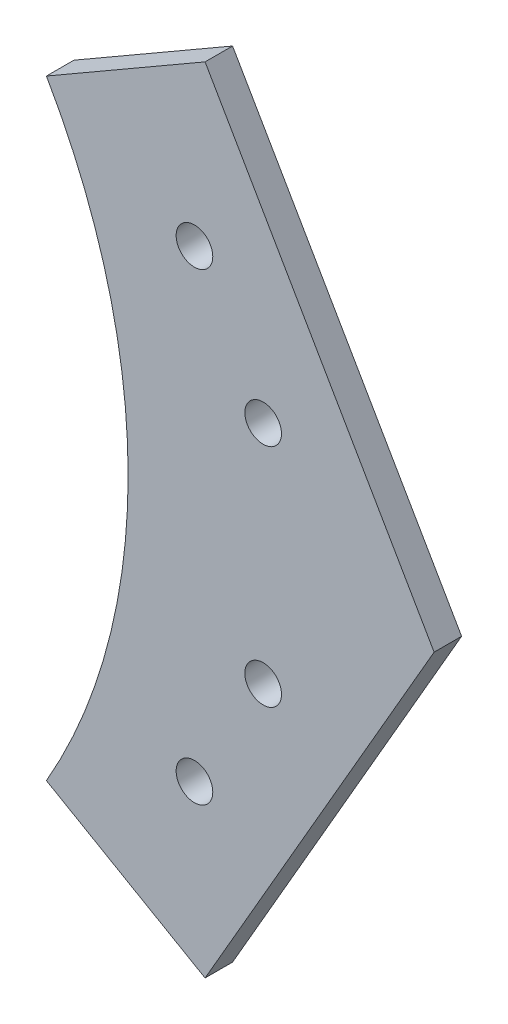
ISO-10303-21;
HEADER;
FILE_DESCRIPTION(('STEP AP214'),'2;1');
FILE_NAME('part.step','',(''),(''),'','','');
FILE_SCHEMA(('AUTOMOTIVE_DESIGN { 1 0 10303 214 1 1 1 1 }'));
ENDSEC;
DATA;
#1=APPLICATION_CONTEXT('core data for automotive mechanical design processes');
#2=APPLICATION_PROTOCOL_DEFINITION('international standard','automotive_design',2000,#1);
#3=PRODUCT_CONTEXT('',#1,'mechanical');
#4=PRODUCT('Part','Part','',(#3));
#5=PRODUCT_RELATED_PRODUCT_CATEGORY('part','',(#4));
#6=PRODUCT_DEFINITION_FORMATION('','',#4);
#7=PRODUCT_DEFINITION_CONTEXT('part definition',#1,'design');
#8=PRODUCT_DEFINITION('design','',#6,#7);
#9=PRODUCT_DEFINITION_SHAPE('','',#8);
#10=(LENGTH_UNIT() NAMED_UNIT(*) SI_UNIT(.MILLI.,.METRE.));
#11=(NAMED_UNIT(*) PLANE_ANGLE_UNIT() SI_UNIT($,.RADIAN.));
#12=(NAMED_UNIT(*) SI_UNIT($,.STERADIAN.) SOLID_ANGLE_UNIT());
#13=UNCERTAINTY_MEASURE_WITH_UNIT(LENGTH_MEASURE(1.E-05),#10,'distance_accuracy_value','');
#14=(GEOMETRIC_REPRESENTATION_CONTEXT(3) GLOBAL_UNCERTAINTY_ASSIGNED_CONTEXT((#13)) GLOBAL_UNIT_ASSIGNED_CONTEXT((#10,
#11,#12)) REPRESENTATION_CONTEXT('',''));
#15=CARTESIAN_POINT('',(0.,0.,0.));
#16=DIRECTION('',(0.,0.,1.));
#17=DIRECTION('',(1.,0.,0.));
#18=AXIS2_PLACEMENT_3D('',#15,#16,#17);
#19=CARTESIAN_POINT('',(-69.125390922664,-1.1129612220826,3.));
#20=DIRECTION('',(0.,0.,1.));
#21=DIRECTION('',(1.,0.,0.));
#22=AXIS2_PLACEMENT_3D('',#19,#20,#21);
#23=PLANE('',#22);
#24=CARTESIAN_POINT('',(12.2143550394917,11.2075468536065,3.));
#25=DIRECTION('',(0.,0.,1.));
#26=DIRECTION('',(1.,0.,0.));
#27=AXIS2_PLACEMENT_3D('',#24,#25,#26);
#28=CIRCLE('',#27,2.);
#29=CARTESIAN_POINT('',(14.2143550394917,11.2075468536065,3.));
#30=VERTEX_POINT('',#29);
#31=EDGE_CURVE('E199',#30,#30,#28,.T.);
#32=ORIENTED_EDGE('',*,*,#31,.F.);
#33=EDGE_LOOP('',(#32));
#34=FACE_BOUND('',#33,.T.);
#35=CARTESIAN_POINT('',(4.71435503949169,-26.4238503545378,3.));
#36=DIRECTION('',(0.,0.,1.));
#37=DIRECTION('',(1.,0.,0.));
#38=AXIS2_PLACEMENT_3D('',#35,#36,#37);
#39=CIRCLE('',#38,1.99999999999994);
#40=CARTESIAN_POINT('',(6.71435503949164,-26.4238503545378,3.));
#41=VERTEX_POINT('',#40);
#42=EDGE_CURVE('E130',#41,#41,#39,.T.);
#43=ORIENTED_EDGE('',*,*,#42,.F.);
#44=EDGE_LOOP('',(#43));
#45=FACE_BOUND('',#44,.T.);
#46=DIRECTION('',(0.5,0.866025403784438,0.));
#47=VECTOR('',#46,1.);
#48=CARTESIAN_POINT('',(5.87460907733611,-44.4142314113042,3.));
#49=LINE('',#48,#47);
#50=CARTESIAN_POINT('',(5.87460907733611,-44.4142314113042,3.));
#51=VERTEX_POINT('',#50);
#52=CARTESIAN_POINT('',(30.8746090773361,-1.11296122208226,3.));
#53=VERTEX_POINT('',#52);
#54=EDGE_CURVE('E139',#51,#53,#49,.T.);
#55=ORIENTED_EDGE('',*,*,#54,.T.);
#56=DIRECTION('',(-0.500000000000001,0.866025403784438,0.));
#57=VECTOR('',#56,1.);
#58=CARTESIAN_POINT('',(30.8746090773361,-1.11296122208226,3.));
#59=LINE('',#58,#57);
#60=CARTESIAN_POINT('',(5.87460907733606,42.1883089671397,3.));
#61=VERTEX_POINT('',#60);
#62=EDGE_CURVE('E97',#53,#61,#59,.T.);
#63=ORIENTED_EDGE('',*,*,#62,.T.);
#64=DIRECTION('',(-0.866025403784435,-0.500000000000005,0.));
#65=VECTOR('',#64,1.);
#66=CARTESIAN_POINT('',(5.87460907733606,42.1883089671397,3.));
#67=LINE('',#66,#65);
#68=CARTESIAN_POINT('',(-11.4458989983527,32.1883089671395,3.));
#69=VERTEX_POINT('',#68);
#70=EDGE_CURVE('E101',#61,#69,#67,.T.);
#71=ORIENTED_EDGE('',*,*,#70,.T.);
#72=CARTESIAN_POINT('',(-69.125390922664,-1.1129612220826,3.));
#73=DIRECTION('',(0.,0.,-1.));
#74=DIRECTION('',(1.,0.,0.));
#75=AXIS2_PLACEMENT_3D('',#72,#73,#74);
#76=CIRCLE('',#75,66.602540378444);
#77=CARTESIAN_POINT('',(-11.4458989983526,-34.4142314113043,3.));
#78=VERTEX_POINT('',#77);
#79=EDGE_CURVE('E105',#69,#78,#76,.T.);
#80=ORIENTED_EDGE('',*,*,#79,.T.);
#81=DIRECTION('',(0.86602540378444,-0.499999999999997,0.));
#82=VECTOR('',#81,1.);
#83=CARTESIAN_POINT('',(-11.4458989983526,-34.4142314113043,3.));
#84=LINE('',#83,#82);
#85=EDGE_CURVE('E63',#78,#51,#84,.T.);
#86=ORIENTED_EDGE('',*,*,#85,.T.);
#87=EDGE_LOOP('',(#55,#63,#71,#80,#86));
#88=FACE_BOUND('',#87,.T.);
#89=CARTESIAN_POINT('',(12.2143550394916,-13.4334692977711,3.));
#90=DIRECTION('',(0.,0.,1.));
#91=DIRECTION('',(1.,0.,0.));
#92=AXIS2_PLACEMENT_3D('',#89,#90,#91);
#93=CIRCLE('',#92,2.);
#94=CARTESIAN_POINT('',(14.2143550394916,-13.4334692977711,3.));
#95=VERTEX_POINT('',#94);
#96=EDGE_CURVE('E207',#95,#95,#93,.T.);
#97=ORIENTED_EDGE('',*,*,#96,.F.);
#98=EDGE_LOOP('',(#97));
#99=FACE_BOUND('',#98,.T.);
#100=CARTESIAN_POINT('',(4.71435503949169,24.197927910373,3.));
#101=DIRECTION('',(0.,0.,1.));
#102=DIRECTION('',(1.,0.,0.));
#103=AXIS2_PLACEMENT_3D('',#100,#101,#102);
#104=CIRCLE('',#103,2.);
#105=CARTESIAN_POINT('',(6.71435503949169,24.197927910373,3.));
#106=VERTEX_POINT('',#105);
#107=EDGE_CURVE('E188',#106,#106,#104,.T.);
#108=ORIENTED_EDGE('',*,*,#107,.F.);
#109=EDGE_LOOP('',(#108));
#110=FACE_BOUND('',#109,.T.);
#111=ADVANCED_FACE('F45',(#34,#45,#88,#99,#110),#23,.T.);
#112=CARTESIAN_POINT('',(-69.125390922664,-1.1129612220826,0.));
#113=DIRECTION('',(0.,0.,1.));
#114=DIRECTION('',(1.,0.,0.));
#115=AXIS2_PLACEMENT_3D('',#112,#113,#114);
#116=PLANE('',#115);
#117=DIRECTION('',(0.5,0.866025403784438,0.));
#118=VECTOR('',#117,1.);
#119=CARTESIAN_POINT('',(5.87460907733611,-44.4142314113042,0.));
#120=LINE('',#119,#118);
#121=CARTESIAN_POINT('',(5.87460907733611,-44.4142314113042,0.));
#122=VERTEX_POINT('',#121);
#123=CARTESIAN_POINT('',(30.8746090773361,-1.11296122208226,0.));
#124=VERTEX_POINT('',#123);
#125=EDGE_CURVE('E125',#122,#124,#120,.T.);
#126=ORIENTED_EDGE('',*,*,#125,.F.);
#127=DIRECTION('',(0.86602540378444,-0.499999999999997,0.));
#128=VECTOR('',#127,1.);
#129=CARTESIAN_POINT('',(-11.4458989983526,-34.4142314113043,0.));
#130=LINE('',#129,#128);
#131=CARTESIAN_POINT('',(-11.4458989983526,-34.4142314113043,0.));
#132=VERTEX_POINT('',#131);
#133=EDGE_CURVE('E89',#132,#122,#130,.T.);
#134=ORIENTED_EDGE('',*,*,#133,.F.);
#135=CARTESIAN_POINT('',(-69.125390922664,-1.1129612220826,0.));
#136=DIRECTION('',(0.,0.,-1.));
#137=DIRECTION('',(1.,0.,0.));
#138=AXIS2_PLACEMENT_3D('',#135,#136,#137);
#139=CIRCLE('',#138,66.602540378444);
#140=CARTESIAN_POINT('',(-11.4458989983527,32.1883089671395,0.));
#141=VERTEX_POINT('',#140);
#142=EDGE_CURVE('E83',#141,#132,#139,.T.);
#143=ORIENTED_EDGE('',*,*,#142,.F.);
#144=DIRECTION('',(-0.866025403784435,-0.500000000000005,0.));
#145=VECTOR('',#144,1.);
#146=CARTESIAN_POINT('',(5.87460907733606,42.1883089671397,0.));
#147=LINE('',#146,#145);
#148=CARTESIAN_POINT('',(5.87460907733606,42.1883089671397,0.));
#149=VERTEX_POINT('',#148);
#150=EDGE_CURVE('E113',#149,#141,#147,.T.);
#151=ORIENTED_EDGE('',*,*,#150,.F.);
#152=DIRECTION('',(-0.500000000000001,0.866025403784438,0.));
#153=VECTOR('',#152,1.);
#154=CARTESIAN_POINT('',(30.8746090773361,-1.11296122208226,0.));
#155=LINE('',#154,#153);
#156=EDGE_CURVE('E129',#124,#149,#155,.T.);
#157=ORIENTED_EDGE('',*,*,#156,.F.);
#158=EDGE_LOOP('',(#126,#134,#143,#151,#157));
#159=FACE_BOUND('',#158,.T.);
#160=CARTESIAN_POINT('',(4.71435503949169,-26.4238503545378,0.));
#161=DIRECTION('',(0.,0.,1.));
#162=DIRECTION('',(1.,0.,0.));
#163=AXIS2_PLACEMENT_3D('',#160,#161,#162);
#164=CIRCLE('',#163,1.99999999999994);
#165=CARTESIAN_POINT('',(6.71435503949164,-26.4238503545378,0.));
#166=VERTEX_POINT('',#165);
#167=EDGE_CURVE('E211',#166,#166,#164,.T.);
#168=ORIENTED_EDGE('',*,*,#167,.T.);
#169=EDGE_LOOP('',(#168));
#170=FACE_BOUND('',#169,.T.);
#171=CARTESIAN_POINT('',(12.2143550394916,-13.4334692977711,0.));
#172=DIRECTION('',(0.,0.,1.));
#173=DIRECTION('',(1.,0.,0.));
#174=AXIS2_PLACEMENT_3D('',#171,#172,#173);
#175=CIRCLE('',#174,2.);
#176=CARTESIAN_POINT('',(14.2143550394916,-13.4334692977711,0.));
#177=VERTEX_POINT('',#176);
#178=EDGE_CURVE('E203',#177,#177,#175,.T.);
#179=ORIENTED_EDGE('',*,*,#178,.T.);
#180=EDGE_LOOP('',(#179));
#181=FACE_BOUND('',#180,.T.);
#182=CARTESIAN_POINT('',(12.2143550394917,11.2075468536065,0.));
#183=DIRECTION('',(0.,0.,1.));
#184=DIRECTION('',(1.,0.,0.));
#185=AXIS2_PLACEMENT_3D('',#182,#183,#184);
#186=CIRCLE('',#185,2.);
#187=CARTESIAN_POINT('',(14.2143550394917,11.2075468536065,0.));
#188=VERTEX_POINT('',#187);
#189=EDGE_CURVE('E196',#188,#188,#186,.T.);
#190=ORIENTED_EDGE('',*,*,#189,.T.);
#191=EDGE_LOOP('',(#190));
#192=FACE_BOUND('',#191,.T.);
#193=CARTESIAN_POINT('',(4.71435503949169,24.197927910373,0.));
#194=DIRECTION('',(0.,0.,1.));
#195=DIRECTION('',(1.,0.,0.));
#196=AXIS2_PLACEMENT_3D('',#193,#194,#195);
#197=CIRCLE('',#196,2.);
#198=CARTESIAN_POINT('',(6.71435503949169,24.197927910373,0.));
#199=VERTEX_POINT('',#198);
#200=EDGE_CURVE('E191',#199,#199,#197,.T.);
#201=ORIENTED_EDGE('',*,*,#200,.T.);
#202=EDGE_LOOP('',(#201));
#203=FACE_BOUND('',#202,.T.);
#204=ADVANCED_FACE('F146',(#159,#170,#181,#192,#203),#116,.F.);
#205=CARTESIAN_POINT('',(5.87460907733611,-44.4142314113042,3.));
#206=DIRECTION('',(-0.866025403784438,0.500000000000001,0.));
#207=DIRECTION('',(-0.500000000000001,-0.866025403784438,0.));
#208=AXIS2_PLACEMENT_3D('',#205,#206,#207);
#209=PLANE('',#208);
#210=ORIENTED_EDGE('',*,*,#125,.T.);
#211=DIRECTION('',(0.,0.,-1.));
#212=VECTOR('',#211,1.);
#213=CARTESIAN_POINT('',(30.8746090773361,-1.11296122208226,3.));
#214=LINE('',#213,#212);
#215=EDGE_CURVE('E11',#53,#124,#214,.T.);
#216=ORIENTED_EDGE('',*,*,#215,.F.);
#217=ORIENTED_EDGE('',*,*,#54,.F.);
#218=DIRECTION('',(0.,0.,-1.));
#219=VECTOR('',#218,1.);
#220=CARTESIAN_POINT('',(5.87460907733611,-44.4142314113042,3.));
#221=LINE('',#220,#219);
#222=EDGE_CURVE('E121',#51,#122,#221,.T.);
#223=ORIENTED_EDGE('',*,*,#222,.T.);
#224=EDGE_LOOP('',(#210,#216,#217,#223));
#225=FACE_BOUND('',#224,.T.);
#226=ADVANCED_FACE('F47',(#225),#209,.F.);
#227=CARTESIAN_POINT('',(30.8746090773361,-1.11296122208226,3.));
#228=DIRECTION('',(-0.866025403784438,-0.500000000000001,0.));
#229=DIRECTION('',(0.500000000000001,-0.866025403784438,0.));
#230=AXIS2_PLACEMENT_3D('',#227,#228,#229);
#231=PLANE('',#230);
#232=ORIENTED_EDGE('',*,*,#156,.T.);
#233=DIRECTION('',(0.,0.,-1.));
#234=VECTOR('',#233,1.);
#235=CARTESIAN_POINT('',(5.87460907733606,42.1883089671397,3.));
#236=LINE('',#235,#234);
#237=EDGE_CURVE('E55',#61,#149,#236,.T.);
#238=ORIENTED_EDGE('',*,*,#237,.F.);
#239=ORIENTED_EDGE('',*,*,#62,.F.);
#240=ORIENTED_EDGE('',*,*,#215,.T.);
#241=EDGE_LOOP('',(#232,#238,#239,#240));
#242=FACE_BOUND('',#241,.T.);
#243=ADVANCED_FACE('F269',(#242),#231,.F.);
#244=CARTESIAN_POINT('',(5.87460907733606,42.1883089671397,3.));
#245=DIRECTION('',(0.500000000000005,-0.866025403784436,0.));
#246=DIRECTION('',(0.866025403784436,0.500000000000005,0.));
#247=AXIS2_PLACEMENT_3D('',#244,#245,#246);
#248=PLANE('',#247);
#249=ORIENTED_EDGE('',*,*,#150,.T.);
#250=DIRECTION('',(0.,0.,-1.));
#251=VECTOR('',#250,1.);
#252=CARTESIAN_POINT('',(-11.4458989983527,32.1883089671395,3.));
#253=LINE('',#252,#251);
#254=EDGE_CURVE('E110',#69,#141,#253,.T.);
#255=ORIENTED_EDGE('',*,*,#254,.F.);
#256=ORIENTED_EDGE('',*,*,#70,.F.);
#257=ORIENTED_EDGE('',*,*,#237,.T.);
#258=EDGE_LOOP('',(#249,#255,#256,#257));
#259=FACE_BOUND('',#258,.T.);
#260=ADVANCED_FACE('F111',(#259),#248,.F.);
#261=CARTESIAN_POINT('',(-69.125390922664,-1.1129612220826,3.));
#262=DIRECTION('',(0.,0.,-1.));
#263=DIRECTION('',(-1.,0.,0.));
#264=AXIS2_PLACEMENT_3D('',#261,#262,#263);
#265=CYLINDRICAL_SURFACE('',#264,66.602540378444);
#266=ORIENTED_EDGE('',*,*,#142,.T.);
#267=DIRECTION('',(0.,0.,-1.));
#268=VECTOR('',#267,1.);
#269=CARTESIAN_POINT('',(-11.4458989983526,-34.4142314113043,3.));
#270=LINE('',#269,#268);
#271=EDGE_CURVE('E115',#78,#132,#270,.T.);
#272=ORIENTED_EDGE('',*,*,#271,.F.);
#273=ORIENTED_EDGE('',*,*,#79,.F.);
#274=ORIENTED_EDGE('',*,*,#254,.T.);
#275=EDGE_LOOP('',(#266,#272,#273,#274));
#276=FACE_BOUND('',#275,.T.);
#277=ADVANCED_FACE('F117',(#276),#265,.F.);
#278=CARTESIAN_POINT('',(-11.4458989983526,-34.4142314113043,3.));
#279=DIRECTION('',(0.499999999999997,0.86602540378444,0.));
#280=DIRECTION('',(-0.86602540378444,0.499999999999997,0.));
#281=AXIS2_PLACEMENT_3D('',#278,#279,#280);
#282=PLANE('',#281);
#283=ORIENTED_EDGE('',*,*,#133,.T.);
#284=ORIENTED_EDGE('',*,*,#222,.F.);
#285=ORIENTED_EDGE('',*,*,#85,.F.);
#286=ORIENTED_EDGE('',*,*,#271,.T.);
#287=EDGE_LOOP('',(#283,#284,#285,#286));
#288=FACE_BOUND('',#287,.T.);
#289=ADVANCED_FACE('F151',(#288),#282,.F.);
#290=CARTESIAN_POINT('',(4.71435503949169,-26.4238503545378,3.));
#291=DIRECTION('',(0.,0.,-1.));
#292=DIRECTION('',(-1.,0.,0.));
#293=AXIS2_PLACEMENT_3D('',#290,#291,#292);
#294=CYLINDRICAL_SURFACE('',#293,1.99999999999994);
#295=ORIENTED_EDGE('',*,*,#42,.T.);
#296=EDGE_LOOP('',(#295));
#297=FACE_BOUND('',#296,.T.);
#298=ORIENTED_EDGE('',*,*,#167,.F.);
#299=EDGE_LOOP('',(#298));
#300=FACE_BOUND('',#299,.T.);
#301=ADVANCED_FACE('F153',(#297,#300),#294,.F.);
#302=CARTESIAN_POINT('',(12.2143550394916,-13.4334692977711,3.));
#303=DIRECTION('',(0.,0.,-1.));
#304=DIRECTION('',(-1.,0.,0.));
#305=AXIS2_PLACEMENT_3D('',#302,#303,#304);
#306=CYLINDRICAL_SURFACE('',#305,2.);
#307=ORIENTED_EDGE('',*,*,#96,.T.);
#308=EDGE_LOOP('',(#307));
#309=FACE_BOUND('',#308,.T.);
#310=ORIENTED_EDGE('',*,*,#178,.F.);
#311=EDGE_LOOP('',(#310));
#312=FACE_BOUND('',#311,.T.);
#313=ADVANCED_FACE('F159',(#309,#312),#306,.F.);
#314=CARTESIAN_POINT('',(12.2143550394917,11.2075468536065,3.));
#315=DIRECTION('',(0.,0.,-1.));
#316=DIRECTION('',(-1.,0.,0.));
#317=AXIS2_PLACEMENT_3D('',#314,#315,#316);
#318=CYLINDRICAL_SURFACE('',#317,2.);
#319=ORIENTED_EDGE('',*,*,#31,.T.);
#320=EDGE_LOOP('',(#319));
#321=FACE_BOUND('',#320,.T.);
#322=ORIENTED_EDGE('',*,*,#189,.F.);
#323=EDGE_LOOP('',(#322));
#324=FACE_BOUND('',#323,.T.);
#325=ADVANCED_FACE('F175',(#321,#324),#318,.F.);
#326=CARTESIAN_POINT('',(4.71435503949169,24.197927910373,3.));
#327=DIRECTION('',(0.,0.,-1.));
#328=DIRECTION('',(-1.,0.,0.));
#329=AXIS2_PLACEMENT_3D('',#326,#327,#328);
#330=CYLINDRICAL_SURFACE('',#329,2.);
#331=ORIENTED_EDGE('',*,*,#107,.T.);
#332=EDGE_LOOP('',(#331));
#333=FACE_BOUND('',#332,.T.);
#334=ORIENTED_EDGE('',*,*,#200,.F.);
#335=EDGE_LOOP('',(#334));
#336=FACE_BOUND('',#335,.T.);
#337=ADVANCED_FACE('F179',(#333,#336),#330,.F.);
#338=CLOSED_SHELL('',(#111,#204,#226,#243,#260,#277,#289,#301,#313,#325,#337));
#339=MANIFOLD_SOLID_BREP('B2',#338);
#340=ADVANCED_BREP_SHAPE_REPRESENTATION('',(#18,#339),#14);
#341=SHAPE_DEFINITION_REPRESENTATION(#9,#340);
ENDSEC;
END-ISO-10303-21;
